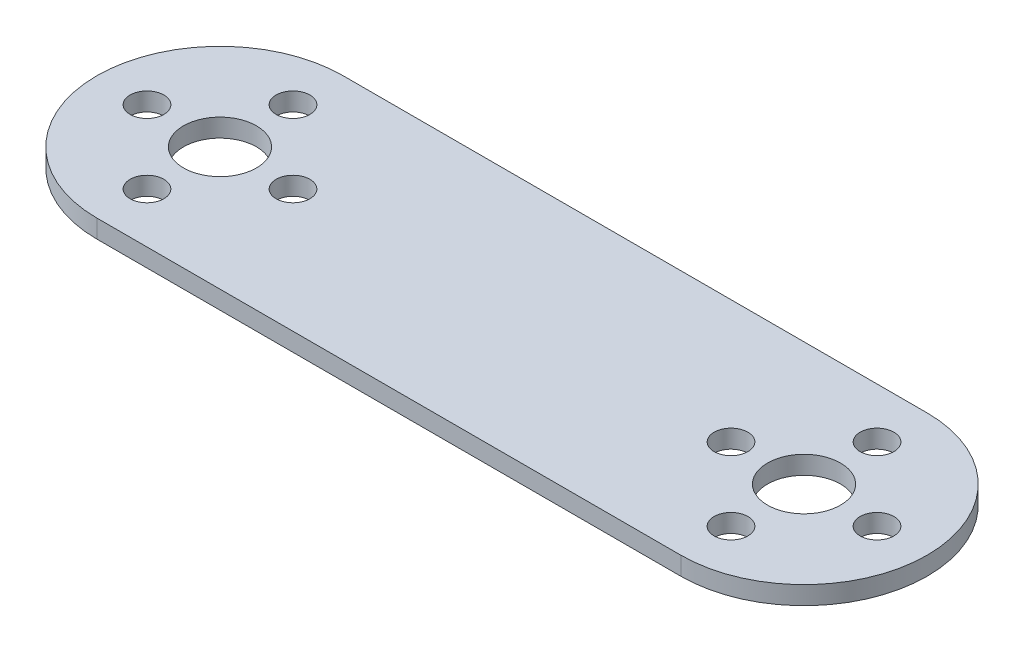
ISO-10303-21;
HEADER;
FILE_DESCRIPTION(('STEP AP214'),'2;1');
FILE_NAME('part.step','',(''),(''),'','','');
FILE_SCHEMA(('AUTOMOTIVE_DESIGN { 1 0 10303 214 1 1 1 1 }'));
ENDSEC;
DATA;
#1=APPLICATION_CONTEXT('core data for automotive mechanical design processes');
#2=APPLICATION_PROTOCOL_DEFINITION('international standard','automotive_design',2000,#1);
#3=PRODUCT_CONTEXT('',#1,'mechanical');
#4=PRODUCT('Part','Part','',(#3));
#5=PRODUCT_RELATED_PRODUCT_CATEGORY('part','',(#4));
#6=PRODUCT_DEFINITION_FORMATION('','',#4);
#7=PRODUCT_DEFINITION_CONTEXT('part definition',#1,'design');
#8=PRODUCT_DEFINITION('design','',#6,#7);
#9=PRODUCT_DEFINITION_SHAPE('','',#8);
#10=(LENGTH_UNIT() NAMED_UNIT(*) SI_UNIT(.MILLI.,.METRE.));
#11=(NAMED_UNIT(*) PLANE_ANGLE_UNIT() SI_UNIT($,.RADIAN.));
#12=(NAMED_UNIT(*) SI_UNIT($,.STERADIAN.) SOLID_ANGLE_UNIT());
#13=UNCERTAINTY_MEASURE_WITH_UNIT(LENGTH_MEASURE(1.E-05),#10,'distance_accuracy_value','');
#14=(GEOMETRIC_REPRESENTATION_CONTEXT(3) GLOBAL_UNCERTAINTY_ASSIGNED_CONTEXT((#13)) GLOBAL_UNIT_ASSIGNED_CONTEXT((#10,
#11,#12)) REPRESENTATION_CONTEXT('',''));
#15=CARTESIAN_POINT('',(0.,0.,0.));
#16=DIRECTION('',(0.,0.,1.));
#17=DIRECTION('',(1.,0.,0.));
#18=AXIS2_PLACEMENT_3D('',#15,#16,#17);
#19=CARTESIAN_POINT('',(64.,0.,0.));
#20=DIRECTION('',(0.,1.,0.));
#21=DIRECTION('',(0.,0.,1.));
#22=AXIS2_PLACEMENT_3D('',#19,#20,#21);
#23=CYLINDRICAL_SURFACE('',#22,13.5);
#24=CARTESIAN_POINT('',(64.,2.,0.));
#25=DIRECTION('',(0.,1.,0.));
#26=DIRECTION('',(0.,0.,1.));
#27=AXIS2_PLACEMENT_3D('',#24,#25,#26);
#28=CIRCLE('',#27,13.5);
#29=CARTESIAN_POINT('',(64.,2.,13.5));
#30=VERTEX_POINT('',#29);
#31=CARTESIAN_POINT('',(64.,2.,-13.5));
#32=VERTEX_POINT('',#31);
#33=EDGE_CURVE('E98',#30,#32,#28,.T.);
#34=ORIENTED_EDGE('',*,*,#33,.F.);
#35=DIRECTION('',(0.,1.,0.));
#36=VECTOR('',#35,1.);
#37=CARTESIAN_POINT('',(64.,0.,13.5));
#38=LINE('',#37,#36);
#39=CARTESIAN_POINT('',(64.,0.,13.5));
#40=VERTEX_POINT('',#39);
#41=EDGE_CURVE('E11',#40,#30,#38,.T.);
#42=ORIENTED_EDGE('',*,*,#41,.F.);
#43=CARTESIAN_POINT('',(64.,0.,0.));
#44=DIRECTION('',(0.,1.,0.));
#45=DIRECTION('',(0.,0.,1.));
#46=AXIS2_PLACEMENT_3D('',#43,#44,#45);
#47=CIRCLE('',#46,13.5);
#48=CARTESIAN_POINT('',(64.,0.,-13.5));
#49=VERTEX_POINT('',#48);
#50=EDGE_CURVE('E91',#40,#49,#47,.T.);
#51=ORIENTED_EDGE('',*,*,#50,.T.);
#52=DIRECTION('',(0.,1.,0.));
#53=VECTOR('',#52,1.);
#54=CARTESIAN_POINT('',(64.,0.,-13.5));
#55=LINE('',#54,#53);
#56=EDGE_CURVE('E36',#49,#32,#55,.T.);
#57=ORIENTED_EDGE('',*,*,#56,.T.);
#58=EDGE_LOOP('',(#34,#42,#51,#57));
#59=FACE_BOUND('',#58,.T.);
#60=ADVANCED_FACE('F33',(#59),#23,.T.);
#61=CARTESIAN_POINT('',(0.,0.,13.5));
#62=DIRECTION('',(0.,0.,1.));
#63=DIRECTION('',(1.,0.,0.));
#64=AXIS2_PLACEMENT_3D('',#61,#62,#63);
#65=PLANE('',#64);
#66=DIRECTION('',(1.,0.,0.));
#67=VECTOR('',#66,1.);
#68=CARTESIAN_POINT('',(0.,2.,13.5));
#69=LINE('',#68,#67);
#70=CARTESIAN_POINT('',(0.,2.,13.5));
#71=VERTEX_POINT('',#70);
#72=EDGE_CURVE('E93',#71,#30,#69,.T.);
#73=ORIENTED_EDGE('',*,*,#72,.F.);
#74=DIRECTION('',(0.,1.,0.));
#75=VECTOR('',#74,1.);
#76=CARTESIAN_POINT('',(0.,0.,13.5));
#77=LINE('',#76,#75);
#78=CARTESIAN_POINT('',(0.,0.,13.5));
#79=VERTEX_POINT('',#78);
#80=EDGE_CURVE('E42',#79,#71,#77,.T.);
#81=ORIENTED_EDGE('',*,*,#80,.F.);
#82=DIRECTION('',(1.,0.,0.));
#83=VECTOR('',#82,1.);
#84=CARTESIAN_POINT('',(0.,0.,13.5));
#85=LINE('',#84,#83);
#86=EDGE_CURVE('E88',#79,#40,#85,.T.);
#87=ORIENTED_EDGE('',*,*,#86,.T.);
#88=ORIENTED_EDGE('',*,*,#41,.T.);
#89=EDGE_LOOP('',(#73,#81,#87,#88));
#90=FACE_BOUND('',#89,.T.);
#91=ADVANCED_FACE('F109',(#90),#65,.T.);
#92=CARTESIAN_POINT('',(0.,0.,0.));
#93=DIRECTION('',(0.,1.,0.));
#94=DIRECTION('',(0.,0.,1.));
#95=AXIS2_PLACEMENT_3D('',#92,#93,#94);
#96=CYLINDRICAL_SURFACE('',#95,13.5);
#97=CARTESIAN_POINT('',(0.,2.,0.));
#98=DIRECTION('',(0.,1.,0.));
#99=DIRECTION('',(0.,0.,1.));
#100=AXIS2_PLACEMENT_3D('',#97,#98,#99);
#101=CIRCLE('',#100,13.5);
#102=CARTESIAN_POINT('',(0.,2.,-13.5));
#103=VERTEX_POINT('',#102);
#104=EDGE_CURVE('E83',#103,#71,#101,.T.);
#105=ORIENTED_EDGE('',*,*,#104,.F.);
#106=DIRECTION('',(0.,1.,0.));
#107=VECTOR('',#106,1.);
#108=CARTESIAN_POINT('',(0.,0.,-13.5));
#109=LINE('',#108,#107);
#110=CARTESIAN_POINT('',(0.,0.,-13.5));
#111=VERTEX_POINT('',#110);
#112=EDGE_CURVE('E78',#111,#103,#109,.T.);
#113=ORIENTED_EDGE('',*,*,#112,.F.);
#114=CARTESIAN_POINT('',(0.,0.,0.));
#115=DIRECTION('',(0.,1.,0.));
#116=DIRECTION('',(0.,0.,1.));
#117=AXIS2_PLACEMENT_3D('',#114,#115,#116);
#118=CIRCLE('',#117,13.5);
#119=EDGE_CURVE('E81',#111,#79,#118,.T.);
#120=ORIENTED_EDGE('',*,*,#119,.T.);
#121=ORIENTED_EDGE('',*,*,#80,.T.);
#122=EDGE_LOOP('',(#105,#113,#120,#121));
#123=FACE_BOUND('',#122,.T.);
#124=ADVANCED_FACE('F80',(#123),#96,.T.);
#125=CARTESIAN_POINT('',(64.,0.,-13.5));
#126=DIRECTION('',(0.,0.,-1.));
#127=DIRECTION('',(-1.,0.,0.));
#128=AXIS2_PLACEMENT_3D('',#125,#126,#127);
#129=PLANE('',#128);
#130=DIRECTION('',(-1.,0.,0.));
#131=VECTOR('',#130,1.);
#132=CARTESIAN_POINT('',(64.,2.,-13.5));
#133=LINE('',#132,#131);
#134=EDGE_CURVE('E101',#32,#103,#133,.T.);
#135=ORIENTED_EDGE('',*,*,#134,.F.);
#136=ORIENTED_EDGE('',*,*,#56,.F.);
#137=DIRECTION('',(-1.,0.,0.));
#138=VECTOR('',#137,1.);
#139=CARTESIAN_POINT('',(64.,0.,-13.5));
#140=LINE('',#139,#138);
#141=EDGE_CURVE('E87',#49,#111,#140,.T.);
#142=ORIENTED_EDGE('',*,*,#141,.T.);
#143=ORIENTED_EDGE('',*,*,#112,.T.);
#144=EDGE_LOOP('',(#135,#136,#142,#143));
#145=FACE_BOUND('',#144,.T.);
#146=ADVANCED_FACE('F90',(#145),#129,.T.);
#147=CARTESIAN_POINT('',(64.,0.,0.));
#148=DIRECTION('',(0.,1.,0.));
#149=DIRECTION('',(0.,0.,1.));
#150=AXIS2_PLACEMENT_3D('',#147,#148,#149);
#151=PLANE('',#150);
#152=CARTESIAN_POINT('',(0.,0.,0.));
#153=DIRECTION('',(0.,1.,0.));
#154=DIRECTION('',(0.,0.,-1.));
#155=AXIS2_PLACEMENT_3D('',#152,#153,#154);
#156=CIRCLE('',#155,4.);
#157=CARTESIAN_POINT('',(0.,0.,-4.));
#158=VERTEX_POINT('',#157);
#159=EDGE_CURVE('E174',#158,#158,#156,.T.);
#160=ORIENTED_EDGE('',*,*,#159,.T.);
#161=EDGE_LOOP('',(#160));
#162=FACE_BOUND('',#161,.T.);
#163=CARTESIAN_POINT('',(0.,0.,-8.));
#164=DIRECTION('',(0.,1.,0.));
#165=DIRECTION('',(0.,0.,-1.));
#166=AXIS2_PLACEMENT_3D('',#163,#164,#165);
#167=CIRCLE('',#166,1.85);
#168=CARTESIAN_POINT('',(0.,0.,-9.85));
#169=VERTEX_POINT('',#168);
#170=EDGE_CURVE('E182',#169,#169,#167,.T.);
#171=ORIENTED_EDGE('',*,*,#170,.T.);
#172=EDGE_LOOP('',(#171));
#173=FACE_BOUND('',#172,.T.);
#174=CARTESIAN_POINT('',(8.,0.,0.));
#175=DIRECTION('',(0.,1.,0.));
#176=DIRECTION('',(0.,0.,-1.));
#177=AXIS2_PLACEMENT_3D('',#174,#175,#176);
#178=CIRCLE('',#177,1.85);
#179=CARTESIAN_POINT('',(8.,0.,-1.85));
#180=VERTEX_POINT('',#179);
#181=EDGE_CURVE('E188',#180,#180,#178,.T.);
#182=ORIENTED_EDGE('',*,*,#181,.T.);
#183=EDGE_LOOP('',(#182));
#184=FACE_BOUND('',#183,.T.);
#185=CARTESIAN_POINT('',(0.,0.,8.));
#186=DIRECTION('',(0.,1.,0.));
#187=DIRECTION('',(0.,0.,-1.));
#188=AXIS2_PLACEMENT_3D('',#185,#186,#187);
#189=CIRCLE('',#188,1.85);
#190=CARTESIAN_POINT('',(0.,0.,6.15));
#191=VERTEX_POINT('',#190);
#192=EDGE_CURVE('E194',#191,#191,#189,.T.);
#193=ORIENTED_EDGE('',*,*,#192,.T.);
#194=EDGE_LOOP('',(#193));
#195=FACE_BOUND('',#194,.T.);
#196=CARTESIAN_POINT('',(-8.,0.,0.));
#197=DIRECTION('',(0.,1.,0.));
#198=DIRECTION('',(0.,0.,-1.));
#199=AXIS2_PLACEMENT_3D('',#196,#197,#198);
#200=CIRCLE('',#199,1.85);
#201=CARTESIAN_POINT('',(-8.,0.,-1.85));
#202=VERTEX_POINT('',#201);
#203=EDGE_CURVE('E200',#202,#202,#200,.T.);
#204=ORIENTED_EDGE('',*,*,#203,.T.);
#205=EDGE_LOOP('',(#204));
#206=FACE_BOUND('',#205,.T.);
#207=CARTESIAN_POINT('',(64.,0.,0.));
#208=DIRECTION('',(0.,1.,0.));
#209=DIRECTION('',(0.,0.,-1.));
#210=AXIS2_PLACEMENT_3D('',#207,#208,#209);
#211=CIRCLE('',#210,4.);
#212=CARTESIAN_POINT('',(64.,0.,-4.));
#213=VERTEX_POINT('',#212);
#214=EDGE_CURVE('E206',#213,#213,#211,.T.);
#215=ORIENTED_EDGE('',*,*,#214,.T.);
#216=EDGE_LOOP('',(#215));
#217=FACE_BOUND('',#216,.T.);
#218=CARTESIAN_POINT('',(64.,0.,-8.));
#219=DIRECTION('',(0.,1.,0.));
#220=DIRECTION('',(0.,0.,-1.));
#221=AXIS2_PLACEMENT_3D('',#218,#219,#220);
#222=CIRCLE('',#221,1.85);
#223=CARTESIAN_POINT('',(64.,0.,-9.85));
#224=VERTEX_POINT('',#223);
#225=EDGE_CURVE('E212',#224,#224,#222,.T.);
#226=ORIENTED_EDGE('',*,*,#225,.T.);
#227=EDGE_LOOP('',(#226));
#228=FACE_BOUND('',#227,.T.);
#229=CARTESIAN_POINT('',(72.,0.,0.));
#230=DIRECTION('',(0.,1.,0.));
#231=DIRECTION('',(0.,0.,-1.));
#232=AXIS2_PLACEMENT_3D('',#229,#230,#231);
#233=CIRCLE('',#232,1.85);
#234=CARTESIAN_POINT('',(72.,0.,-1.85));
#235=VERTEX_POINT('',#234);
#236=EDGE_CURVE('E218',#235,#235,#233,.T.);
#237=ORIENTED_EDGE('',*,*,#236,.T.);
#238=EDGE_LOOP('',(#237));
#239=FACE_BOUND('',#238,.T.);
#240=CARTESIAN_POINT('',(64.,0.,8.));
#241=DIRECTION('',(0.,1.,0.));
#242=DIRECTION('',(0.,0.,-1.));
#243=AXIS2_PLACEMENT_3D('',#240,#241,#242);
#244=CIRCLE('',#243,1.85);
#245=CARTESIAN_POINT('',(64.,0.,6.15));
#246=VERTEX_POINT('',#245);
#247=EDGE_CURVE('E224',#246,#246,#244,.T.);
#248=ORIENTED_EDGE('',*,*,#247,.T.);
#249=EDGE_LOOP('',(#248));
#250=FACE_BOUND('',#249,.T.);
#251=CARTESIAN_POINT('',(56.,0.,0.));
#252=DIRECTION('',(0.,1.,0.));
#253=DIRECTION('',(0.,0.,-1.));
#254=AXIS2_PLACEMENT_3D('',#251,#252,#253);
#255=CIRCLE('',#254,1.85);
#256=CARTESIAN_POINT('',(56.,0.,-1.85));
#257=VERTEX_POINT('',#256);
#258=EDGE_CURVE('E102',#257,#257,#255,.T.);
#259=ORIENTED_EDGE('',*,*,#258,.T.);
#260=EDGE_LOOP('',(#259));
#261=FACE_BOUND('',#260,.T.);
#262=ORIENTED_EDGE('',*,*,#50,.F.);
#263=ORIENTED_EDGE('',*,*,#86,.F.);
#264=ORIENTED_EDGE('',*,*,#119,.F.);
#265=ORIENTED_EDGE('',*,*,#141,.F.);
#266=EDGE_LOOP('',(#262,#263,#264,#265));
#267=FACE_BOUND('',#266,.T.);
#268=ADVANCED_FACE('F86',(#162,#173,#184,#195,#206,#217,#228,#239,#250,#261,#267),#151,.F.);
#269=CARTESIAN_POINT('',(64.,2.,0.));
#270=DIRECTION('',(0.,1.,0.));
#271=DIRECTION('',(0.,0.,1.));
#272=AXIS2_PLACEMENT_3D('',#269,#270,#271);
#273=PLANE('',#272);
#274=CARTESIAN_POINT('',(0.,2.,0.));
#275=DIRECTION('',(0.,1.,0.));
#276=DIRECTION('',(0.,0.,-1.));
#277=AXIS2_PLACEMENT_3D('',#274,#275,#276);
#278=CIRCLE('',#277,4.);
#279=CARTESIAN_POINT('',(0.,2.,-4.));
#280=VERTEX_POINT('',#279);
#281=EDGE_CURVE('E177',#280,#280,#278,.T.);
#282=ORIENTED_EDGE('',*,*,#281,.F.);
#283=EDGE_LOOP('',(#282));
#284=FACE_BOUND('',#283,.T.);
#285=CARTESIAN_POINT('',(0.,2.,-8.));
#286=DIRECTION('',(0.,1.,0.));
#287=DIRECTION('',(0.,0.,-1.));
#288=AXIS2_PLACEMENT_3D('',#285,#286,#287);
#289=CIRCLE('',#288,1.85);
#290=CARTESIAN_POINT('',(0.,2.,-9.85));
#291=VERTEX_POINT('',#290);
#292=EDGE_CURVE('E179',#291,#291,#289,.T.);
#293=ORIENTED_EDGE('',*,*,#292,.F.);
#294=EDGE_LOOP('',(#293));
#295=FACE_BOUND('',#294,.T.);
#296=CARTESIAN_POINT('',(8.,2.,0.));
#297=DIRECTION('',(0.,1.,0.));
#298=DIRECTION('',(0.,0.,-1.));
#299=AXIS2_PLACEMENT_3D('',#296,#297,#298);
#300=CIRCLE('',#299,1.85);
#301=CARTESIAN_POINT('',(8.,2.,-1.85));
#302=VERTEX_POINT('',#301);
#303=EDGE_CURVE('E185',#302,#302,#300,.T.);
#304=ORIENTED_EDGE('',*,*,#303,.F.);
#305=EDGE_LOOP('',(#304));
#306=FACE_BOUND('',#305,.T.);
#307=CARTESIAN_POINT('',(0.,2.,8.));
#308=DIRECTION('',(0.,1.,0.));
#309=DIRECTION('',(0.,0.,-1.));
#310=AXIS2_PLACEMENT_3D('',#307,#308,#309);
#311=CIRCLE('',#310,1.85);
#312=CARTESIAN_POINT('',(0.,2.,6.15));
#313=VERTEX_POINT('',#312);
#314=EDGE_CURVE('E191',#313,#313,#311,.T.);
#315=ORIENTED_EDGE('',*,*,#314,.F.);
#316=EDGE_LOOP('',(#315));
#317=FACE_BOUND('',#316,.T.);
#318=CARTESIAN_POINT('',(-8.,2.,0.));
#319=DIRECTION('',(0.,1.,0.));
#320=DIRECTION('',(0.,0.,-1.));
#321=AXIS2_PLACEMENT_3D('',#318,#319,#320);
#322=CIRCLE('',#321,1.85);
#323=CARTESIAN_POINT('',(-8.,2.,-1.85));
#324=VERTEX_POINT('',#323);
#325=EDGE_CURVE('E197',#324,#324,#322,.T.);
#326=ORIENTED_EDGE('',*,*,#325,.F.);
#327=EDGE_LOOP('',(#326));
#328=FACE_BOUND('',#327,.T.);
#329=CARTESIAN_POINT('',(64.,2.,0.));
#330=DIRECTION('',(0.,1.,0.));
#331=DIRECTION('',(0.,0.,-1.));
#332=AXIS2_PLACEMENT_3D('',#329,#330,#331);
#333=CIRCLE('',#332,4.);
#334=CARTESIAN_POINT('',(64.,2.,-4.));
#335=VERTEX_POINT('',#334);
#336=EDGE_CURVE('E203',#335,#335,#333,.T.);
#337=ORIENTED_EDGE('',*,*,#336,.F.);
#338=EDGE_LOOP('',(#337));
#339=FACE_BOUND('',#338,.T.);
#340=CARTESIAN_POINT('',(64.,2.,-8.));
#341=DIRECTION('',(0.,1.,0.));
#342=DIRECTION('',(0.,0.,-1.));
#343=AXIS2_PLACEMENT_3D('',#340,#341,#342);
#344=CIRCLE('',#343,1.85);
#345=CARTESIAN_POINT('',(64.,2.,-9.85));
#346=VERTEX_POINT('',#345);
#347=EDGE_CURVE('E209',#346,#346,#344,.T.);
#348=ORIENTED_EDGE('',*,*,#347,.F.);
#349=EDGE_LOOP('',(#348));
#350=FACE_BOUND('',#349,.T.);
#351=CARTESIAN_POINT('',(72.,2.,0.));
#352=DIRECTION('',(0.,1.,0.));
#353=DIRECTION('',(0.,0.,-1.));
#354=AXIS2_PLACEMENT_3D('',#351,#352,#353);
#355=CIRCLE('',#354,1.85);
#356=CARTESIAN_POINT('',(72.,2.,-1.85));
#357=VERTEX_POINT('',#356);
#358=EDGE_CURVE('E215',#357,#357,#355,.T.);
#359=ORIENTED_EDGE('',*,*,#358,.F.);
#360=EDGE_LOOP('',(#359));
#361=FACE_BOUND('',#360,.T.);
#362=CARTESIAN_POINT('',(64.,2.,8.));
#363=DIRECTION('',(0.,1.,0.));
#364=DIRECTION('',(0.,0.,-1.));
#365=AXIS2_PLACEMENT_3D('',#362,#363,#364);
#366=CIRCLE('',#365,1.85);
#367=CARTESIAN_POINT('',(64.,2.,6.15));
#368=VERTEX_POINT('',#367);
#369=EDGE_CURVE('E221',#368,#368,#366,.T.);
#370=ORIENTED_EDGE('',*,*,#369,.F.);
#371=EDGE_LOOP('',(#370));
#372=FACE_BOUND('',#371,.T.);
#373=CARTESIAN_POINT('',(56.,2.,0.));
#374=DIRECTION('',(0.,1.,0.));
#375=DIRECTION('',(0.,0.,-1.));
#376=AXIS2_PLACEMENT_3D('',#373,#374,#375);
#377=CIRCLE('',#376,1.85);
#378=CARTESIAN_POINT('',(56.,2.,-1.85));
#379=VERTEX_POINT('',#378);
#380=EDGE_CURVE('E227',#379,#379,#377,.T.);
#381=ORIENTED_EDGE('',*,*,#380,.F.);
#382=EDGE_LOOP('',(#381));
#383=FACE_BOUND('',#382,.T.);
#384=ORIENTED_EDGE('',*,*,#33,.T.);
#385=ORIENTED_EDGE('',*,*,#134,.T.);
#386=ORIENTED_EDGE('',*,*,#104,.T.);
#387=ORIENTED_EDGE('',*,*,#72,.T.);
#388=EDGE_LOOP('',(#384,#385,#386,#387));
#389=FACE_BOUND('',#388,.T.);
#390=ADVANCED_FACE('F108',(#284,#295,#306,#317,#328,#339,#350,#361,#372,#383,#389),#273,.T.);
#391=CARTESIAN_POINT('',(56.,0.,0.));
#392=DIRECTION('',(0.,1.,0.));
#393=DIRECTION('',(0.,0.,1.));
#394=AXIS2_PLACEMENT_3D('',#391,#392,#393);
#395=CYLINDRICAL_SURFACE('',#394,1.85);
#396=ORIENTED_EDGE('',*,*,#258,.F.);
#397=EDGE_LOOP('',(#396));
#398=FACE_BOUND('',#397,.T.);
#399=ORIENTED_EDGE('',*,*,#380,.T.);
#400=EDGE_LOOP('',(#399));
#401=FACE_BOUND('',#400,.T.);
#402=ADVANCED_FACE('F127',(#398,#401),#395,.F.);
#403=CARTESIAN_POINT('',(64.,0.,8.));
#404=DIRECTION('',(0.,1.,0.));
#405=DIRECTION('',(0.,0.,1.));
#406=AXIS2_PLACEMENT_3D('',#403,#404,#405);
#407=CYLINDRICAL_SURFACE('',#406,1.85);
#408=ORIENTED_EDGE('',*,*,#247,.F.);
#409=EDGE_LOOP('',(#408));
#410=FACE_BOUND('',#409,.T.);
#411=ORIENTED_EDGE('',*,*,#369,.T.);
#412=EDGE_LOOP('',(#411));
#413=FACE_BOUND('',#412,.T.);
#414=ADVANCED_FACE('F134',(#410,#413),#407,.F.);
#415=CARTESIAN_POINT('',(72.,0.,0.));
#416=DIRECTION('',(0.,1.,0.));
#417=DIRECTION('',(0.,0.,1.));
#418=AXIS2_PLACEMENT_3D('',#415,#416,#417);
#419=CYLINDRICAL_SURFACE('',#418,1.85);
#420=ORIENTED_EDGE('',*,*,#236,.F.);
#421=EDGE_LOOP('',(#420));
#422=FACE_BOUND('',#421,.T.);
#423=ORIENTED_EDGE('',*,*,#358,.T.);
#424=EDGE_LOOP('',(#423));
#425=FACE_BOUND('',#424,.T.);
#426=ADVANCED_FACE('F138',(#422,#425),#419,.F.);
#427=CARTESIAN_POINT('',(64.,0.,-8.));
#428=DIRECTION('',(0.,1.,0.));
#429=DIRECTION('',(0.,0.,1.));
#430=AXIS2_PLACEMENT_3D('',#427,#428,#429);
#431=CYLINDRICAL_SURFACE('',#430,1.85);
#432=ORIENTED_EDGE('',*,*,#225,.F.);
#433=EDGE_LOOP('',(#432));
#434=FACE_BOUND('',#433,.T.);
#435=ORIENTED_EDGE('',*,*,#347,.T.);
#436=EDGE_LOOP('',(#435));
#437=FACE_BOUND('',#436,.T.);
#438=ADVANCED_FACE('F142',(#434,#437),#431,.F.);
#439=CARTESIAN_POINT('',(64.,0.,0.));
#440=DIRECTION('',(0.,1.,0.));
#441=DIRECTION('',(0.,0.,1.));
#442=AXIS2_PLACEMENT_3D('',#439,#440,#441);
#443=CYLINDRICAL_SURFACE('',#442,4.);
#444=ORIENTED_EDGE('',*,*,#214,.F.);
#445=EDGE_LOOP('',(#444));
#446=FACE_BOUND('',#445,.T.);
#447=ORIENTED_EDGE('',*,*,#336,.T.);
#448=EDGE_LOOP('',(#447));
#449=FACE_BOUND('',#448,.T.);
#450=ADVANCED_FACE('F146',(#446,#449),#443,.F.);
#451=CARTESIAN_POINT('',(-8.,0.,0.));
#452=DIRECTION('',(0.,1.,0.));
#453=DIRECTION('',(0.,0.,1.));
#454=AXIS2_PLACEMENT_3D('',#451,#452,#453);
#455=CYLINDRICAL_SURFACE('',#454,1.85);
#456=ORIENTED_EDGE('',*,*,#203,.F.);
#457=EDGE_LOOP('',(#456));
#458=FACE_BOUND('',#457,.T.);
#459=ORIENTED_EDGE('',*,*,#325,.T.);
#460=EDGE_LOOP('',(#459));
#461=FACE_BOUND('',#460,.T.);
#462=ADVANCED_FACE('F150',(#458,#461),#455,.F.);
#463=CARTESIAN_POINT('',(0.,0.,8.));
#464=DIRECTION('',(0.,1.,0.));
#465=DIRECTION('',(0.,0.,1.));
#466=AXIS2_PLACEMENT_3D('',#463,#464,#465);
#467=CYLINDRICAL_SURFACE('',#466,1.85);
#468=ORIENTED_EDGE('',*,*,#192,.F.);
#469=EDGE_LOOP('',(#468));
#470=FACE_BOUND('',#469,.T.);
#471=ORIENTED_EDGE('',*,*,#314,.T.);
#472=EDGE_LOOP('',(#471));
#473=FACE_BOUND('',#472,.T.);
#474=ADVANCED_FACE('F154',(#470,#473),#467,.F.);
#475=CARTESIAN_POINT('',(8.,0.,0.));
#476=DIRECTION('',(0.,1.,0.));
#477=DIRECTION('',(0.,0.,1.));
#478=AXIS2_PLACEMENT_3D('',#475,#476,#477);
#479=CYLINDRICAL_SURFACE('',#478,1.85);
#480=ORIENTED_EDGE('',*,*,#181,.F.);
#481=EDGE_LOOP('',(#480));
#482=FACE_BOUND('',#481,.T.);
#483=ORIENTED_EDGE('',*,*,#303,.T.);
#484=EDGE_LOOP('',(#483));
#485=FACE_BOUND('',#484,.T.);
#486=ADVANCED_FACE('F158',(#482,#485),#479,.F.);
#487=CARTESIAN_POINT('',(0.,0.,-8.));
#488=DIRECTION('',(0.,1.,0.));
#489=DIRECTION('',(0.,0.,1.));
#490=AXIS2_PLACEMENT_3D('',#487,#488,#489);
#491=CYLINDRICAL_SURFACE('',#490,1.85);
#492=ORIENTED_EDGE('',*,*,#170,.F.);
#493=EDGE_LOOP('',(#492));
#494=FACE_BOUND('',#493,.T.);
#495=ORIENTED_EDGE('',*,*,#292,.T.);
#496=EDGE_LOOP('',(#495));
#497=FACE_BOUND('',#496,.T.);
#498=ADVANCED_FACE('F162',(#494,#497),#491,.F.);
#499=CARTESIAN_POINT('',(0.,0.,0.));
#500=DIRECTION('',(0.,1.,0.));
#501=DIRECTION('',(0.,0.,1.));
#502=AXIS2_PLACEMENT_3D('',#499,#500,#501);
#503=CYLINDRICAL_SURFACE('',#502,4.);
#504=ORIENTED_EDGE('',*,*,#159,.F.);
#505=EDGE_LOOP('',(#504));
#506=FACE_BOUND('',#505,.T.);
#507=ORIENTED_EDGE('',*,*,#281,.T.);
#508=EDGE_LOOP('',(#507));
#509=FACE_BOUND('',#508,.T.);
#510=ADVANCED_FACE('F166',(#506,#509),#503,.F.);
#511=CLOSED_SHELL('',(#60,#91,#124,#146,#268,#390,#402,#414,#426,#438,#450,#462,#474,#486,#498,#510));
#512=MANIFOLD_SOLID_BREP('B2',#511);
#513=ADVANCED_BREP_SHAPE_REPRESENTATION('',(#18,#512),#14);
#514=SHAPE_DEFINITION_REPRESENTATION(#9,#513);
ENDSEC;
END-ISO-10303-21;
